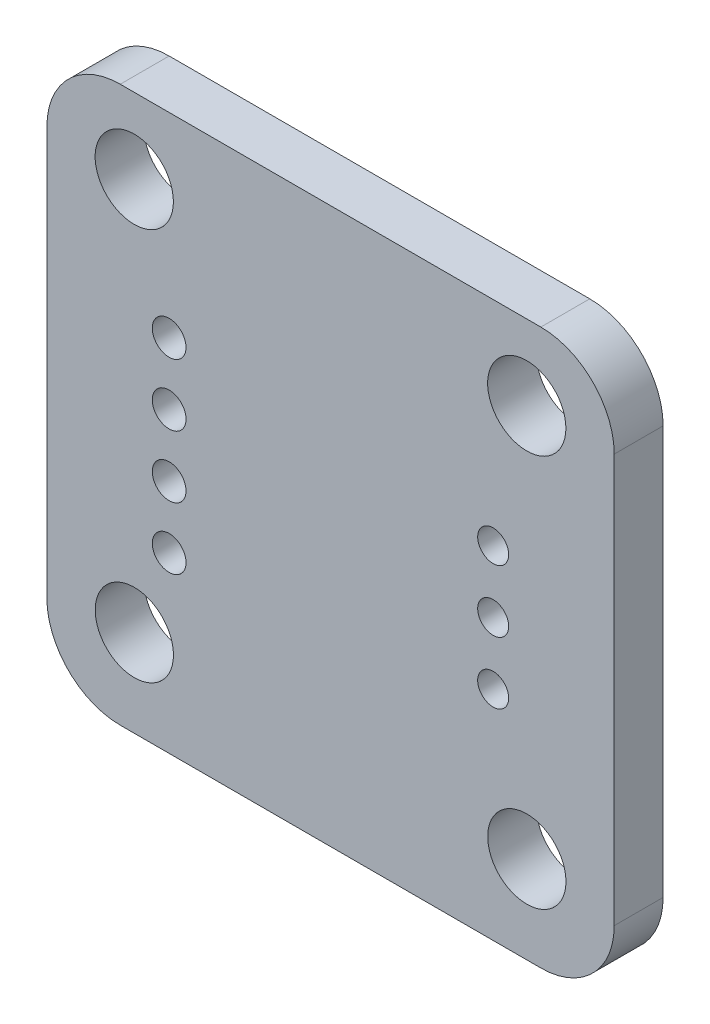
ISO-10303-21;
HEADER;
FILE_DESCRIPTION(('STEP AP214'),'2;1');
FILE_NAME('part.step','',(''),(''),'','','');
FILE_SCHEMA(('AUTOMOTIVE_DESIGN { 1 0 10303 214 1 1 1 1 }'));
ENDSEC;
DATA;
#1=APPLICATION_CONTEXT('core data for automotive mechanical design processes');
#2=APPLICATION_PROTOCOL_DEFINITION('international standard','automotive_design',2000,#1);
#3=PRODUCT_CONTEXT('',#1,'mechanical');
#4=PRODUCT('Part','Part','',(#3));
#5=PRODUCT_RELATED_PRODUCT_CATEGORY('part','',(#4));
#6=PRODUCT_DEFINITION_FORMATION('','',#4);
#7=PRODUCT_DEFINITION_CONTEXT('part definition',#1,'design');
#8=PRODUCT_DEFINITION('design','',#6,#7);
#9=PRODUCT_DEFINITION_SHAPE('','',#8);
#10=(LENGTH_UNIT() NAMED_UNIT(*) SI_UNIT(.MILLI.,.METRE.));
#11=(NAMED_UNIT(*) PLANE_ANGLE_UNIT() SI_UNIT($,.RADIAN.));
#12=(NAMED_UNIT(*) SI_UNIT($,.STERADIAN.) SOLID_ANGLE_UNIT());
#13=UNCERTAINTY_MEASURE_WITH_UNIT(LENGTH_MEASURE(1.E-05),#10,'distance_accuracy_value','');
#14=(GEOMETRIC_REPRESENTATION_CONTEXT(3) GLOBAL_UNCERTAINTY_ASSIGNED_CONTEXT((#13)) GLOBAL_UNIT_ASSIGNED_CONTEXT((#10,
#11,#12)) REPRESENTATION_CONTEXT('',''));
#15=CARTESIAN_POINT('',(0.,0.,0.));
#16=DIRECTION('',(0.,0.,1.));
#17=DIRECTION('',(1.,0.,0.));
#18=AXIS2_PLACEMENT_3D('',#15,#16,#17);
#19=CARTESIAN_POINT('',(0.,0.,2.));
#20=DIRECTION('',(0.,0.,1.));
#21=DIRECTION('',(1.,0.,0.));
#22=AXIS2_PLACEMENT_3D('',#19,#20,#21);
#23=PLANE('',#22);
#24=CARTESIAN_POINT('',(6.64706805457635,-0.157067135375505,2.));
#25=DIRECTION('',(0.,0.,1.));
#26=DIRECTION('',(1.,0.,0.));
#27=AXIS2_PLACEMENT_3D('',#24,#25,#26);
#28=CIRCLE('',#27,0.633596252878906);
#29=CARTESIAN_POINT('',(7.28066430745526,-0.157067135375505,2.));
#30=VERTEX_POINT('',#29);
#31=EDGE_CURVE('E226',#30,#30,#28,.T.);
#32=ORIENTED_EDGE('',*,*,#31,.F.);
#33=EDGE_LOOP('',(#32));
#34=FACE_BOUND('',#33,.T.);
#35=CARTESIAN_POINT('',(6.64706805457635,2.3829328646245,2.));
#36=DIRECTION('',(0.,0.,1.));
#37=DIRECTION('',(1.,0.,0.));
#38=AXIS2_PLACEMENT_3D('',#35,#36,#37);
#39=CIRCLE('',#38,0.633596252878906);
#40=CARTESIAN_POINT('',(7.28066430745526,2.3829328646245,2.));
#41=VERTEX_POINT('',#40);
#42=EDGE_CURVE('E220',#41,#41,#39,.T.);
#43=ORIENTED_EDGE('',*,*,#42,.F.);
#44=EDGE_LOOP('',(#43));
#45=FACE_BOUND('',#44,.T.);
#46=CARTESIAN_POINT('',(-6.60293194542365,-4.49706713537551,2.));
#47=DIRECTION('',(0.,0.,1.));
#48=DIRECTION('',(1.,0.,0.));
#49=AXIS2_PLACEMENT_3D('',#46,#47,#48);
#50=CIRCLE('',#49,0.690319611344519);
#51=CARTESIAN_POINT('',(-5.91261233407913,-4.49706713537551,2.));
#52=VERTEX_POINT('',#51);
#53=EDGE_CURVE('E214',#52,#52,#50,.T.);
#54=ORIENTED_EDGE('',*,*,#53,.F.);
#55=EDGE_LOOP('',(#54));
#56=FACE_BOUND('',#55,.T.);
#57=CARTESIAN_POINT('',(-6.60293194542365,-1.95706713537551,2.));
#58=DIRECTION('',(0.,0.,1.));
#59=DIRECTION('',(1.,0.,0.));
#60=AXIS2_PLACEMENT_3D('',#57,#58,#59);
#61=CIRCLE('',#60,0.690319611344519);
#62=CARTESIAN_POINT('',(-5.91261233407913,-1.95706713537551,2.));
#63=VERTEX_POINT('',#62);
#64=EDGE_CURVE('E207',#63,#63,#61,.T.);
#65=ORIENTED_EDGE('',*,*,#64,.F.);
#66=EDGE_LOOP('',(#65));
#67=FACE_BOUND('',#66,.T.);
#68=CARTESIAN_POINT('',(-6.60293194542365,0.582932864624494,2.));
#69=DIRECTION('',(0.,0.,1.));
#70=DIRECTION('',(1.,0.,0.));
#71=AXIS2_PLACEMENT_3D('',#68,#69,#70);
#72=CIRCLE('',#71,0.690319611344519);
#73=CARTESIAN_POINT('',(-5.91261233407913,0.582932864624494,2.));
#74=VERTEX_POINT('',#73);
#75=EDGE_CURVE('E237',#74,#74,#72,.T.);
#76=ORIENTED_EDGE('',*,*,#75,.F.);
#77=EDGE_LOOP('',(#76));
#78=FACE_BOUND('',#77,.T.);
#79=CARTESIAN_POINT('',(-6.60293194542365,3.12293286462449,2.));
#80=DIRECTION('',(0.,0.,1.));
#81=DIRECTION('',(1.,0.,0.));
#82=AXIS2_PLACEMENT_3D('',#79,#80,#81);
#83=CIRCLE('',#82,0.690319611344519);
#84=CARTESIAN_POINT('',(-5.91261233407913,3.12293286462449,2.));
#85=VERTEX_POINT('',#84);
#86=EDGE_CURVE('E231',#85,#85,#83,.T.);
#87=ORIENTED_EDGE('',*,*,#86,.F.);
#88=EDGE_LOOP('',(#87));
#89=FACE_BOUND('',#88,.T.);
#90=CARTESIAN_POINT('',(6.64706805457635,-2.6970671353755,2.));
#91=DIRECTION('',(0.,0.,1.));
#92=DIRECTION('',(1.,0.,0.));
#93=AXIS2_PLACEMENT_3D('',#90,#91,#92);
#94=CIRCLE('',#93,0.633596252878906);
#95=CARTESIAN_POINT('',(7.28066430745526,-2.6970671353755,2.));
#96=VERTEX_POINT('',#95);
#97=EDGE_CURVE('E201',#96,#96,#94,.T.);
#98=ORIENTED_EDGE('',*,*,#97,.F.);
#99=EDGE_LOOP('',(#98));
#100=FACE_BOUND('',#99,.T.);
#101=CARTESIAN_POINT('',(8.02395036749889,-8.02421567539647,2.));
#102=DIRECTION('',(0.,0.,1.));
#103=DIRECTION('',(1.,0.,0.));
#104=AXIS2_PLACEMENT_3D('',#101,#102,#103);
#105=CIRCLE('',#104,1.6);
#106=CARTESIAN_POINT('',(9.62395036749889,-8.02421567539647,2.));
#107=VERTEX_POINT('',#106);
#108=EDGE_CURVE('E186',#107,#107,#105,.T.);
#109=ORIENTED_EDGE('',*,*,#108,.F.);
#110=EDGE_LOOP('',(#109));
#111=FACE_BOUND('',#110,.T.);
#112=CARTESIAN_POINT('',(-8.02981425834602,8.02421383699495,2.));
#113=DIRECTION('',(0.,0.,1.));
#114=DIRECTION('',(1.,0.,0.));
#115=AXIS2_PLACEMENT_3D('',#112,#113,#114);
#116=CIRCLE('',#115,1.6);
#117=CARTESIAN_POINT('',(-6.42981425834602,8.02421383699495,2.));
#118=VERTEX_POINT('',#117);
#119=EDGE_CURVE('E127',#118,#118,#116,.T.);
#120=ORIENTED_EDGE('',*,*,#119,.F.);
#121=EDGE_LOOP('',(#120));
#122=FACE_BOUND('',#121,.T.);
#123=DIRECTION('',(1.,0.,0.));
#124=VECTOR('',#123,1.);
#125=CARTESIAN_POINT('',(-11.6029319454236,-11.5970671353755,2.));
#126=LINE('',#125,#124);
#127=CARTESIAN_POINT('',(-8.60293194542365,-11.5970671353755,2.));
#128=VERTEX_POINT('',#127);
#129=CARTESIAN_POINT('',(8.59706805457635,-11.5970671353755,2.));
#130=VERTEX_POINT('',#129);
#131=EDGE_CURVE('E136',#128,#130,#126,.T.);
#132=ORIENTED_EDGE('',*,*,#131,.T.);
#133=CARTESIAN_POINT('',(8.59706805457635,-8.59706713537551,2.));
#134=DIRECTION('',(0.,0.,1.));
#135=DIRECTION('',(1.,0.,0.));
#136=AXIS2_PLACEMENT_3D('',#133,#134,#135);
#137=CIRCLE('',#136,3.);
#138=CARTESIAN_POINT('',(11.5970680545764,-8.59706713537551,2.));
#139=VERTEX_POINT('',#138);
#140=EDGE_CURVE('E155',#130,#139,#137,.T.);
#141=ORIENTED_EDGE('',*,*,#140,.T.);
#142=DIRECTION('',(0.,1.,0.));
#143=VECTOR('',#142,1.);
#144=CARTESIAN_POINT('',(11.5970680545764,11.1029328646245,2.));
#145=LINE('',#144,#143);
#146=CARTESIAN_POINT('',(11.5970680545764,8.10293286462449,2.));
#147=VERTEX_POINT('',#146);
#148=EDGE_CURVE('E119',#139,#147,#145,.T.);
#149=ORIENTED_EDGE('',*,*,#148,.T.);
#150=CARTESIAN_POINT('',(8.59706805457635,8.10293286462449,2.));
#151=DIRECTION('',(0.,0.,1.));
#152=DIRECTION('',(1.,0.,0.));
#153=AXIS2_PLACEMENT_3D('',#150,#151,#152);
#154=CIRCLE('',#153,3.);
#155=CARTESIAN_POINT('',(8.59706805457635,11.1029328646245,2.));
#156=VERTEX_POINT('',#155);
#157=EDGE_CURVE('E150',#147,#156,#154,.T.);
#158=ORIENTED_EDGE('',*,*,#157,.T.);
#159=DIRECTION('',(-1.,0.,0.));
#160=VECTOR('',#159,1.);
#161=CARTESIAN_POINT('',(-11.6029319454236,11.1029328646245,2.));
#162=LINE('',#161,#160);
#163=CARTESIAN_POINT('',(-8.60293194542365,11.1029328646245,2.));
#164=VERTEX_POINT('',#163);
#165=EDGE_CURVE('E166',#156,#164,#162,.T.);
#166=ORIENTED_EDGE('',*,*,#165,.T.);
#167=CARTESIAN_POINT('',(-8.60293194542365,8.10293286462449,2.));
#168=DIRECTION('',(0.,0.,1.));
#169=DIRECTION('',(1.,0.,0.));
#170=AXIS2_PLACEMENT_3D('',#167,#168,#169);
#171=CIRCLE('',#170,3.);
#172=CARTESIAN_POINT('',(-11.6029319454236,8.10293286462449,2.));
#173=VERTEX_POINT('',#172);
#174=EDGE_CURVE('E55',#164,#173,#171,.T.);
#175=ORIENTED_EDGE('',*,*,#174,.T.);
#176=DIRECTION('',(0.,-1.,0.));
#177=VECTOR('',#176,1.);
#178=CARTESIAN_POINT('',(-11.6029319454236,11.1029328646245,2.));
#179=LINE('',#178,#177);
#180=CARTESIAN_POINT('',(-11.6029319454236,-8.59706713537551,2.));
#181=VERTEX_POINT('',#180);
#182=EDGE_CURVE('E174',#173,#181,#179,.T.);
#183=ORIENTED_EDGE('',*,*,#182,.T.);
#184=CARTESIAN_POINT('',(-8.60293194542365,-8.59706713537551,2.));
#185=DIRECTION('',(0.,0.,1.));
#186=DIRECTION('',(1.,0.,0.));
#187=AXIS2_PLACEMENT_3D('',#184,#185,#186);
#188=CIRCLE('',#187,3.);
#189=EDGE_CURVE('E153',#181,#128,#188,.T.);
#190=ORIENTED_EDGE('',*,*,#189,.T.);
#191=EDGE_LOOP('',(#132,#141,#149,#158,#166,#175,#183,#190));
#192=FACE_BOUND('',#191,.T.);
#193=CARTESIAN_POINT('',(8.02128281077218,8.02688139372171,2.));
#194=DIRECTION('',(0.,0.,1.));
#195=DIRECTION('',(1.,0.,0.));
#196=AXIS2_PLACEMENT_3D('',#193,#194,#195);
#197=CIRCLE('',#196,1.6);
#198=CARTESIAN_POINT('',(9.62128281077218,8.02688139372171,2.));
#199=VERTEX_POINT('',#198);
#200=EDGE_CURVE('E181',#199,#199,#197,.T.);
#201=ORIENTED_EDGE('',*,*,#200,.F.);
#202=EDGE_LOOP('',(#201));
#203=FACE_BOUND('',#202,.T.);
#204=CARTESIAN_POINT('',(-8.0271467016193,-8.02688323212313,2.));
#205=DIRECTION('',(0.,0.,1.));
#206=DIRECTION('',(1.,0.,0.));
#207=AXIS2_PLACEMENT_3D('',#204,#205,#206);
#208=CIRCLE('',#207,1.6);
#209=CARTESIAN_POINT('',(-6.4271467016193,-8.02688323212313,2.));
#210=VERTEX_POINT('',#209);
#211=EDGE_CURVE('E192',#210,#210,#208,.T.);
#212=ORIENTED_EDGE('',*,*,#211,.F.);
#213=EDGE_LOOP('',(#212));
#214=FACE_BOUND('',#213,.T.);
#215=ADVANCED_FACE('F33',(#34,#45,#56,#67,#78,#89,#100,#111,#122,#192,#203,#214),#23,.T.);
#216=CARTESIAN_POINT('',(0.,0.,0.));
#217=DIRECTION('',(0.,0.,1.));
#218=DIRECTION('',(1.,0.,0.));
#219=AXIS2_PLACEMENT_3D('',#216,#217,#218);
#220=PLANE('',#219);
#221=CARTESIAN_POINT('',(6.64706805457635,-0.157067135375505,0.));
#222=DIRECTION('',(0.,0.,1.));
#223=DIRECTION('',(1.,0.,0.));
#224=AXIS2_PLACEMENT_3D('',#221,#222,#223);
#225=CIRCLE('',#224,0.633596252878906);
#226=CARTESIAN_POINT('',(7.28066430745526,-0.157067135375505,0.));
#227=VERTEX_POINT('',#226);
#228=EDGE_CURVE('E204',#227,#227,#225,.T.);
#229=ORIENTED_EDGE('',*,*,#228,.T.);
#230=EDGE_LOOP('',(#229));
#231=FACE_BOUND('',#230,.T.);
#232=CARTESIAN_POINT('',(6.64706805457635,2.3829328646245,0.));
#233=DIRECTION('',(0.,0.,1.));
#234=DIRECTION('',(1.,0.,0.));
#235=AXIS2_PLACEMENT_3D('',#232,#233,#234);
#236=CIRCLE('',#235,0.633596252878906);
#237=CARTESIAN_POINT('',(7.28066430745526,2.3829328646245,0.));
#238=VERTEX_POINT('',#237);
#239=EDGE_CURVE('E223',#238,#238,#236,.T.);
#240=ORIENTED_EDGE('',*,*,#239,.T.);
#241=EDGE_LOOP('',(#240));
#242=FACE_BOUND('',#241,.T.);
#243=CARTESIAN_POINT('',(-6.60293194542365,-4.49706713537551,0.));
#244=DIRECTION('',(0.,0.,1.));
#245=DIRECTION('',(1.,0.,0.));
#246=AXIS2_PLACEMENT_3D('',#243,#244,#245);
#247=CIRCLE('',#246,0.690319611344519);
#248=CARTESIAN_POINT('',(-5.91261233407913,-4.49706713537551,0.));
#249=VERTEX_POINT('',#248);
#250=EDGE_CURVE('E217',#249,#249,#247,.T.);
#251=ORIENTED_EDGE('',*,*,#250,.T.);
#252=EDGE_LOOP('',(#251));
#253=FACE_BOUND('',#252,.T.);
#254=CARTESIAN_POINT('',(-6.60293194542365,-1.95706713537551,0.));
#255=DIRECTION('',(0.,0.,1.));
#256=DIRECTION('',(1.,0.,0.));
#257=AXIS2_PLACEMENT_3D('',#254,#255,#256);
#258=CIRCLE('',#257,0.690319611344519);
#259=CARTESIAN_POINT('',(-5.91261233407913,-1.95706713537551,0.));
#260=VERTEX_POINT('',#259);
#261=EDGE_CURVE('E210',#260,#260,#258,.T.);
#262=ORIENTED_EDGE('',*,*,#261,.T.);
#263=EDGE_LOOP('',(#262));
#264=FACE_BOUND('',#263,.T.);
#265=CARTESIAN_POINT('',(-6.60293194542365,0.582932864624494,0.));
#266=DIRECTION('',(0.,0.,1.));
#267=DIRECTION('',(1.,0.,0.));
#268=AXIS2_PLACEMENT_3D('',#265,#266,#267);
#269=CIRCLE('',#268,0.690319611344519);
#270=CARTESIAN_POINT('',(-5.91261233407913,0.582932864624494,0.));
#271=VERTEX_POINT('',#270);
#272=EDGE_CURVE('E211',#271,#271,#269,.T.);
#273=ORIENTED_EDGE('',*,*,#272,.T.);
#274=EDGE_LOOP('',(#273));
#275=FACE_BOUND('',#274,.T.);
#276=CARTESIAN_POINT('',(-6.60293194542365,3.12293286462449,0.));
#277=DIRECTION('',(0.,0.,1.));
#278=DIRECTION('',(1.,0.,0.));
#279=AXIS2_PLACEMENT_3D('',#276,#277,#278);
#280=CIRCLE('',#279,0.690319611344519);
#281=CARTESIAN_POINT('',(-5.91261233407913,3.12293286462449,0.));
#282=VERTEX_POINT('',#281);
#283=EDGE_CURVE('E234',#282,#282,#280,.T.);
#284=ORIENTED_EDGE('',*,*,#283,.T.);
#285=EDGE_LOOP('',(#284));
#286=FACE_BOUND('',#285,.T.);
#287=CARTESIAN_POINT('',(6.64706805457635,-2.6970671353755,0.));
#288=DIRECTION('',(0.,0.,1.));
#289=DIRECTION('',(1.,0.,0.));
#290=AXIS2_PLACEMENT_3D('',#287,#288,#289);
#291=CIRCLE('',#290,0.633596252878906);
#292=CARTESIAN_POINT('',(7.28066430745526,-2.6970671353755,0.));
#293=VERTEX_POINT('',#292);
#294=EDGE_CURVE('E198',#293,#293,#291,.T.);
#295=ORIENTED_EDGE('',*,*,#294,.T.);
#296=EDGE_LOOP('',(#295));
#297=FACE_BOUND('',#296,.T.);
#298=DIRECTION('',(0.,1.,0.));
#299=VECTOR('',#298,1.);
#300=CARTESIAN_POINT('',(11.5970680545764,11.1029328646245,0.));
#301=LINE('',#300,#299);
#302=CARTESIAN_POINT('',(11.5970680545764,-8.59706713537551,0.));
#303=VERTEX_POINT('',#302);
#304=CARTESIAN_POINT('',(11.5970680545764,8.10293286462449,0.));
#305=VERTEX_POINT('',#304);
#306=EDGE_CURVE('E116',#303,#305,#301,.T.);
#307=ORIENTED_EDGE('',*,*,#306,.F.);
#308=CARTESIAN_POINT('',(8.59706805457635,-8.59706713537551,0.));
#309=DIRECTION('',(0.,0.,1.));
#310=DIRECTION('',(1.,0.,0.));
#311=AXIS2_PLACEMENT_3D('',#308,#309,#310);
#312=CIRCLE('',#311,3.);
#313=CARTESIAN_POINT('',(8.59706805457635,-11.5970671353755,0.));
#314=VERTEX_POINT('',#313);
#315=EDGE_CURVE('E99',#303,#314,#312,.F.);
#316=ORIENTED_EDGE('',*,*,#315,.T.);
#317=DIRECTION('',(1.,0.,0.));
#318=VECTOR('',#317,1.);
#319=CARTESIAN_POINT('',(-11.6029319454236,-11.5970671353755,0.));
#320=LINE('',#319,#318);
#321=CARTESIAN_POINT('',(-8.60293194542365,-11.5970671353755,0.));
#322=VERTEX_POINT('',#321);
#323=EDGE_CURVE('E140',#322,#314,#320,.T.);
#324=ORIENTED_EDGE('',*,*,#323,.F.);
#325=CARTESIAN_POINT('',(-8.60293194542365,-8.59706713537551,0.));
#326=DIRECTION('',(0.,0.,1.));
#327=DIRECTION('',(1.,0.,0.));
#328=AXIS2_PLACEMENT_3D('',#325,#326,#327);
#329=CIRCLE('',#328,3.);
#330=CARTESIAN_POINT('',(-11.6029319454236,-8.59706713537551,0.));
#331=VERTEX_POINT('',#330);
#332=EDGE_CURVE('E110',#322,#331,#329,.F.);
#333=ORIENTED_EDGE('',*,*,#332,.T.);
#334=DIRECTION('',(0.,-1.,0.));
#335=VECTOR('',#334,1.);
#336=CARTESIAN_POINT('',(-11.6029319454236,11.1029328646245,0.));
#337=LINE('',#336,#335);
#338=CARTESIAN_POINT('',(-11.6029319454236,8.10293286462449,0.));
#339=VERTEX_POINT('',#338);
#340=EDGE_CURVE('E130',#339,#331,#337,.T.);
#341=ORIENTED_EDGE('',*,*,#340,.F.);
#342=CARTESIAN_POINT('',(-8.60293194542365,8.10293286462449,0.));
#343=DIRECTION('',(0.,0.,1.));
#344=DIRECTION('',(1.,0.,0.));
#345=AXIS2_PLACEMENT_3D('',#342,#343,#344);
#346=CIRCLE('',#345,3.);
#347=CARTESIAN_POINT('',(-8.60293194542365,11.1029328646245,0.));
#348=VERTEX_POINT('',#347);
#349=EDGE_CURVE('E144',#339,#348,#346,.F.);
#350=ORIENTED_EDGE('',*,*,#349,.T.);
#351=DIRECTION('',(-1.,0.,0.));
#352=VECTOR('',#351,1.);
#353=CARTESIAN_POINT('',(-11.6029319454236,11.1029328646245,0.));
#354=LINE('',#353,#352);
#355=CARTESIAN_POINT('',(8.59706805457635,11.1029328646245,0.));
#356=VERTEX_POINT('',#355);
#357=EDGE_CURVE('E126',#356,#348,#354,.T.);
#358=ORIENTED_EDGE('',*,*,#357,.F.);
#359=CARTESIAN_POINT('',(8.59706805457635,8.10293286462449,0.));
#360=DIRECTION('',(0.,0.,1.));
#361=DIRECTION('',(1.,0.,0.));
#362=AXIS2_PLACEMENT_3D('',#359,#360,#361);
#363=CIRCLE('',#362,3.);
#364=EDGE_CURVE('E120',#356,#305,#363,.F.);
#365=ORIENTED_EDGE('',*,*,#364,.T.);
#366=EDGE_LOOP('',(#307,#316,#324,#333,#341,#350,#358,#365));
#367=FACE_BOUND('',#366,.T.);
#368=CARTESIAN_POINT('',(-8.02981425834602,8.02421383699495,0.));
#369=DIRECTION('',(0.,0.,1.));
#370=DIRECTION('',(1.,0.,0.));
#371=AXIS2_PLACEMENT_3D('',#368,#369,#370);
#372=CIRCLE('',#371,1.6);
#373=CARTESIAN_POINT('',(-6.42981425834602,8.02421383699495,0.));
#374=VERTEX_POINT('',#373);
#375=EDGE_CURVE('E133',#374,#374,#372,.T.);
#376=ORIENTED_EDGE('',*,*,#375,.T.);
#377=EDGE_LOOP('',(#376));
#378=FACE_BOUND('',#377,.T.);
#379=CARTESIAN_POINT('',(8.02128281077218,8.02688139372171,0.));
#380=DIRECTION('',(0.,0.,1.));
#381=DIRECTION('',(1.,0.,0.));
#382=AXIS2_PLACEMENT_3D('',#379,#380,#381);
#383=CIRCLE('',#382,1.6);
#384=CARTESIAN_POINT('',(9.62128281077218,8.02688139372171,0.));
#385=VERTEX_POINT('',#384);
#386=EDGE_CURVE('E183',#385,#385,#383,.T.);
#387=ORIENTED_EDGE('',*,*,#386,.T.);
#388=EDGE_LOOP('',(#387));
#389=FACE_BOUND('',#388,.T.);
#390=CARTESIAN_POINT('',(8.02395036749889,-8.02421567539647,0.));
#391=DIRECTION('',(0.,0.,1.));
#392=DIRECTION('',(1.,0.,0.));
#393=AXIS2_PLACEMENT_3D('',#390,#391,#392);
#394=CIRCLE('',#393,1.6);
#395=CARTESIAN_POINT('',(9.62395036749889,-8.02421567539647,0.));
#396=VERTEX_POINT('',#395);
#397=EDGE_CURVE('E189',#396,#396,#394,.T.);
#398=ORIENTED_EDGE('',*,*,#397,.T.);
#399=EDGE_LOOP('',(#398));
#400=FACE_BOUND('',#399,.T.);
#401=CARTESIAN_POINT('',(-8.0271467016193,-8.02688323212313,0.));
#402=DIRECTION('',(0.,0.,1.));
#403=DIRECTION('',(1.,0.,0.));
#404=AXIS2_PLACEMENT_3D('',#401,#402,#403);
#405=CIRCLE('',#404,1.6);
#406=CARTESIAN_POINT('',(-6.4271467016193,-8.02688323212313,0.));
#407=VERTEX_POINT('',#406);
#408=EDGE_CURVE('E195',#407,#407,#405,.T.);
#409=ORIENTED_EDGE('',*,*,#408,.T.);
#410=EDGE_LOOP('',(#409));
#411=FACE_BOUND('',#410,.T.);
#412=ADVANCED_FACE('F123',(#231,#242,#253,#264,#275,#286,#297,#367,#378,#389,#400,#411),#220,.F.);
#413=CARTESIAN_POINT('',(11.5970680545764,11.1029328646245,2.));
#414=DIRECTION('',(-1.,0.,0.));
#415=DIRECTION('',(0.,0.,1.));
#416=AXIS2_PLACEMENT_3D('',#413,#414,#415);
#417=PLANE('',#416);
#418=ORIENTED_EDGE('',*,*,#148,.F.);
#419=DIRECTION('',(0.,0.,-1.));
#420=VECTOR('',#419,1.);
#421=CARTESIAN_POINT('',(11.5970680545764,-8.59706713537551,2.));
#422=LINE('',#421,#420);
#423=EDGE_CURVE('E103',#139,#303,#422,.T.);
#424=ORIENTED_EDGE('',*,*,#423,.T.);
#425=ORIENTED_EDGE('',*,*,#306,.T.);
#426=DIRECTION('',(0.,0.,-1.));
#427=VECTOR('',#426,1.);
#428=CARTESIAN_POINT('',(11.5970680545764,8.10293286462449,2.));
#429=LINE('',#428,#427);
#430=EDGE_CURVE('E121',#305,#147,#429,.F.);
#431=ORIENTED_EDGE('',*,*,#430,.T.);
#432=EDGE_LOOP('',(#418,#424,#425,#431));
#433=FACE_BOUND('',#432,.T.);
#434=ADVANCED_FACE('F115',(#433),#417,.F.);
#435=CARTESIAN_POINT('',(-11.6029319454236,11.1029328646245,2.));
#436=DIRECTION('',(0.,-1.,0.));
#437=DIRECTION('',(0.,0.,-1.));
#438=AXIS2_PLACEMENT_3D('',#435,#436,#437);
#439=PLANE('',#438);
#440=ORIENTED_EDGE('',*,*,#357,.T.);
#441=DIRECTION('',(0.,0.,-1.));
#442=VECTOR('',#441,1.);
#443=CARTESIAN_POINT('',(-8.60293194542365,11.1029328646245,2.));
#444=LINE('',#443,#442);
#445=EDGE_CURVE('E11',#348,#164,#444,.F.);
#446=ORIENTED_EDGE('',*,*,#445,.T.);
#447=ORIENTED_EDGE('',*,*,#165,.F.);
#448=DIRECTION('',(0.,0.,-1.));
#449=VECTOR('',#448,1.);
#450=CARTESIAN_POINT('',(8.59706805457635,11.1029328646245,2.));
#451=LINE('',#450,#449);
#452=EDGE_CURVE('E41',#156,#356,#451,.T.);
#453=ORIENTED_EDGE('',*,*,#452,.T.);
#454=EDGE_LOOP('',(#440,#446,#447,#453));
#455=FACE_BOUND('',#454,.T.);
#456=ADVANCED_FACE('F164',(#455),#439,.F.);
#457=CARTESIAN_POINT('',(-11.6029319454236,11.1029328646245,2.));
#458=DIRECTION('',(1.,0.,0.));
#459=DIRECTION('',(0.,0.,-1.));
#460=AXIS2_PLACEMENT_3D('',#457,#458,#459);
#461=PLANE('',#460);
#462=ORIENTED_EDGE('',*,*,#340,.T.);
#463=DIRECTION('',(0.,0.,-1.));
#464=VECTOR('',#463,1.);
#465=CARTESIAN_POINT('',(-11.6029319454236,-8.59706713537551,2.));
#466=LINE('',#465,#464);
#467=EDGE_CURVE('E48',#331,#181,#466,.F.);
#468=ORIENTED_EDGE('',*,*,#467,.T.);
#469=ORIENTED_EDGE('',*,*,#182,.F.);
#470=DIRECTION('',(0.,0.,-1.));
#471=VECTOR('',#470,1.);
#472=CARTESIAN_POINT('',(-11.6029319454236,8.10293286462449,2.));
#473=LINE('',#472,#471);
#474=EDGE_CURVE('E157',#173,#339,#473,.T.);
#475=ORIENTED_EDGE('',*,*,#474,.T.);
#476=EDGE_LOOP('',(#462,#468,#469,#475));
#477=FACE_BOUND('',#476,.T.);
#478=ADVANCED_FACE('F173',(#477),#461,.F.);
#479=CARTESIAN_POINT('',(-11.6029319454236,-11.5970671353755,2.));
#480=DIRECTION('',(0.,1.,0.));
#481=DIRECTION('',(0.,0.,1.));
#482=AXIS2_PLACEMENT_3D('',#479,#480,#481);
#483=PLANE('',#482);
#484=ORIENTED_EDGE('',*,*,#323,.T.);
#485=DIRECTION('',(0.,0.,-1.));
#486=VECTOR('',#485,1.);
#487=CARTESIAN_POINT('',(8.59706805457635,-11.5970671353755,2.));
#488=LINE('',#487,#486);
#489=EDGE_CURVE('E104',#314,#130,#488,.F.);
#490=ORIENTED_EDGE('',*,*,#489,.T.);
#491=ORIENTED_EDGE('',*,*,#131,.F.);
#492=DIRECTION('',(0.,0.,-1.));
#493=VECTOR('',#492,1.);
#494=CARTESIAN_POINT('',(-8.60293194542365,-11.5970671353755,2.));
#495=LINE('',#494,#493);
#496=EDGE_CURVE('E109',#128,#322,#495,.T.);
#497=ORIENTED_EDGE('',*,*,#496,.T.);
#498=EDGE_LOOP('',(#484,#490,#491,#497));
#499=FACE_BOUND('',#498,.T.);
#500=ADVANCED_FACE('F287',(#499),#483,.F.);
#501=CARTESIAN_POINT('',(-8.02981425834602,8.02421383699495,2.));
#502=DIRECTION('',(0.,0.,-1.));
#503=DIRECTION('',(-1.,0.,0.));
#504=AXIS2_PLACEMENT_3D('',#501,#502,#503);
#505=CYLINDRICAL_SURFACE('',#504,1.6);
#506=ORIENTED_EDGE('',*,*,#119,.T.);
#507=EDGE_LOOP('',(#506));
#508=FACE_BOUND('',#507,.T.);
#509=ORIENTED_EDGE('',*,*,#375,.F.);
#510=EDGE_LOOP('',(#509));
#511=FACE_BOUND('',#510,.T.);
#512=ADVANCED_FACE('F290',(#508,#511),#505,.F.);
#513=CARTESIAN_POINT('',(8.02128281077218,8.02688139372171,2.));
#514=DIRECTION('',(0.,0.,-1.));
#515=DIRECTION('',(-1.,0.,0.));
#516=AXIS2_PLACEMENT_3D('',#513,#514,#515);
#517=CYLINDRICAL_SURFACE('',#516,1.6);
#518=ORIENTED_EDGE('',*,*,#200,.T.);
#519=EDGE_LOOP('',(#518));
#520=FACE_BOUND('',#519,.T.);
#521=ORIENTED_EDGE('',*,*,#386,.F.);
#522=EDGE_LOOP('',(#521));
#523=FACE_BOUND('',#522,.T.);
#524=ADVANCED_FACE('F323',(#520,#523),#517,.F.);
#525=CARTESIAN_POINT('',(8.02395036749889,-8.02421567539647,2.));
#526=DIRECTION('',(0.,0.,-1.));
#527=DIRECTION('',(-1.,0.,0.));
#528=AXIS2_PLACEMENT_3D('',#525,#526,#527);
#529=CYLINDRICAL_SURFACE('',#528,1.6);
#530=ORIENTED_EDGE('',*,*,#108,.T.);
#531=EDGE_LOOP('',(#530));
#532=FACE_BOUND('',#531,.T.);
#533=ORIENTED_EDGE('',*,*,#397,.F.);
#534=EDGE_LOOP('',(#533));
#535=FACE_BOUND('',#534,.T.);
#536=ADVANCED_FACE('F273',(#532,#535),#529,.F.);
#537=CARTESIAN_POINT('',(-8.0271467016193,-8.02688323212313,2.));
#538=DIRECTION('',(0.,0.,-1.));
#539=DIRECTION('',(-1.,0.,0.));
#540=AXIS2_PLACEMENT_3D('',#537,#538,#539);
#541=CYLINDRICAL_SURFACE('',#540,1.6);
#542=ORIENTED_EDGE('',*,*,#211,.T.);
#543=EDGE_LOOP('',(#542));
#544=FACE_BOUND('',#543,.T.);
#545=ORIENTED_EDGE('',*,*,#408,.F.);
#546=EDGE_LOOP('',(#545));
#547=FACE_BOUND('',#546,.T.);
#548=ADVANCED_FACE('F270',(#544,#547),#541,.F.);
#549=CARTESIAN_POINT('',(8.59706805457635,-8.59706713537551,2.));
#550=DIRECTION('',(0.,0.,-1.));
#551=DIRECTION('',(-1.,0.,0.));
#552=AXIS2_PLACEMENT_3D('',#549,#550,#551);
#553=CYLINDRICAL_SURFACE('',#552,3.);
#554=ORIENTED_EDGE('',*,*,#140,.F.);
#555=ORIENTED_EDGE('',*,*,#489,.F.);
#556=ORIENTED_EDGE('',*,*,#315,.F.);
#557=ORIENTED_EDGE('',*,*,#423,.F.);
#558=EDGE_LOOP('',(#554,#555,#556,#557));
#559=FACE_BOUND('',#558,.T.);
#560=ADVANCED_FACE('F102',(#559),#553,.T.);
#561=CARTESIAN_POINT('',(-8.60293194542365,-8.59706713537551,2.));
#562=DIRECTION('',(0.,0.,-1.));
#563=DIRECTION('',(-1.,0.,0.));
#564=AXIS2_PLACEMENT_3D('',#561,#562,#563);
#565=CYLINDRICAL_SURFACE('',#564,3.);
#566=ORIENTED_EDGE('',*,*,#189,.F.);
#567=ORIENTED_EDGE('',*,*,#467,.F.);
#568=ORIENTED_EDGE('',*,*,#332,.F.);
#569=ORIENTED_EDGE('',*,*,#496,.F.);
#570=EDGE_LOOP('',(#566,#567,#568,#569));
#571=FACE_BOUND('',#570,.T.);
#572=ADVANCED_FACE('F298',(#571),#565,.T.);
#573=CARTESIAN_POINT('',(-8.60293194542365,8.10293286462449,2.));
#574=DIRECTION('',(0.,0.,-1.));
#575=DIRECTION('',(-1.,0.,0.));
#576=AXIS2_PLACEMENT_3D('',#573,#574,#575);
#577=CYLINDRICAL_SURFACE('',#576,3.);
#578=ORIENTED_EDGE('',*,*,#174,.F.);
#579=ORIENTED_EDGE('',*,*,#445,.F.);
#580=ORIENTED_EDGE('',*,*,#349,.F.);
#581=ORIENTED_EDGE('',*,*,#474,.F.);
#582=EDGE_LOOP('',(#578,#579,#580,#581));
#583=FACE_BOUND('',#582,.T.);
#584=ADVANCED_FACE('F172',(#583),#577,.T.);
#585=CARTESIAN_POINT('',(8.59706805457635,8.10293286462449,2.));
#586=DIRECTION('',(0.,0.,-1.));
#587=DIRECTION('',(-1.,0.,0.));
#588=AXIS2_PLACEMENT_3D('',#585,#586,#587);
#589=CYLINDRICAL_SURFACE('',#588,3.);
#590=ORIENTED_EDGE('',*,*,#157,.F.);
#591=ORIENTED_EDGE('',*,*,#430,.F.);
#592=ORIENTED_EDGE('',*,*,#364,.F.);
#593=ORIENTED_EDGE('',*,*,#452,.F.);
#594=EDGE_LOOP('',(#590,#591,#592,#593));
#595=FACE_BOUND('',#594,.T.);
#596=ADVANCED_FACE('F35',(#595),#589,.T.);
#597=CARTESIAN_POINT('',(6.64706805457635,-2.6970671353755,0.));
#598=DIRECTION('',(0.,0.,1.));
#599=DIRECTION('',(1.,0.,0.));
#600=AXIS2_PLACEMENT_3D('',#597,#598,#599);
#601=CYLINDRICAL_SURFACE('',#600,0.633596252878906);
#602=ORIENTED_EDGE('',*,*,#294,.F.);
#603=EDGE_LOOP('',(#602));
#604=FACE_BOUND('',#603,.T.);
#605=ORIENTED_EDGE('',*,*,#97,.T.);
#606=EDGE_LOOP('',(#605));
#607=FACE_BOUND('',#606,.T.);
#608=ADVANCED_FACE('F305',(#604,#607),#601,.F.);
#609=CARTESIAN_POINT('',(-6.60293194542365,3.12293286462449,0.));
#610=DIRECTION('',(0.,0.,1.));
#611=DIRECTION('',(1.,0.,0.));
#612=AXIS2_PLACEMENT_3D('',#609,#610,#611);
#613=CYLINDRICAL_SURFACE('',#612,0.690319611344519);
#614=ORIENTED_EDGE('',*,*,#283,.F.);
#615=EDGE_LOOP('',(#614));
#616=FACE_BOUND('',#615,.T.);
#617=ORIENTED_EDGE('',*,*,#86,.T.);
#618=EDGE_LOOP('',(#617));
#619=FACE_BOUND('',#618,.T.);
#620=ADVANCED_FACE('F249',(#616,#619),#613,.F.);
#621=CARTESIAN_POINT('',(-6.60293194542365,0.582932864624494,0.));
#622=DIRECTION('',(0.,0.,1.));
#623=DIRECTION('',(1.,0.,0.));
#624=AXIS2_PLACEMENT_3D('',#621,#622,#623);
#625=CYLINDRICAL_SURFACE('',#624,0.690319611344519);
#626=ORIENTED_EDGE('',*,*,#272,.F.);
#627=EDGE_LOOP('',(#626));
#628=FACE_BOUND('',#627,.T.);
#629=ORIENTED_EDGE('',*,*,#75,.T.);
#630=EDGE_LOOP('',(#629));
#631=FACE_BOUND('',#630,.T.);
#632=ADVANCED_FACE('F245',(#628,#631),#625,.F.);
#633=CARTESIAN_POINT('',(-6.60293194542365,-1.95706713537551,0.));
#634=DIRECTION('',(0.,0.,1.));
#635=DIRECTION('',(1.,0.,0.));
#636=AXIS2_PLACEMENT_3D('',#633,#634,#635);
#637=CYLINDRICAL_SURFACE('',#636,0.690319611344519);
#638=ORIENTED_EDGE('',*,*,#261,.F.);
#639=EDGE_LOOP('',(#638));
#640=FACE_BOUND('',#639,.T.);
#641=ORIENTED_EDGE('',*,*,#64,.T.);
#642=EDGE_LOOP('',(#641));
#643=FACE_BOUND('',#642,.T.);
#644=ADVANCED_FACE('F248',(#640,#643),#637,.F.);
#645=CARTESIAN_POINT('',(-6.60293194542365,-4.49706713537551,0.));
#646=DIRECTION('',(0.,0.,1.));
#647=DIRECTION('',(1.,0.,0.));
#648=AXIS2_PLACEMENT_3D('',#645,#646,#647);
#649=CYLINDRICAL_SURFACE('',#648,0.690319611344519);
#650=ORIENTED_EDGE('',*,*,#250,.F.);
#651=EDGE_LOOP('',(#650));
#652=FACE_BOUND('',#651,.T.);
#653=ORIENTED_EDGE('',*,*,#53,.T.);
#654=EDGE_LOOP('',(#653));
#655=FACE_BOUND('',#654,.T.);
#656=ADVANCED_FACE('F406',(#652,#655),#649,.F.);
#657=CARTESIAN_POINT('',(6.64706805457635,2.3829328646245,0.));
#658=DIRECTION('',(0.,0.,1.));
#659=DIRECTION('',(1.,0.,0.));
#660=AXIS2_PLACEMENT_3D('',#657,#658,#659);
#661=CYLINDRICAL_SURFACE('',#660,0.633596252878906);
#662=ORIENTED_EDGE('',*,*,#239,.F.);
#663=EDGE_LOOP('',(#662));
#664=FACE_BOUND('',#663,.T.);
#665=ORIENTED_EDGE('',*,*,#42,.T.);
#666=EDGE_LOOP('',(#665));
#667=FACE_BOUND('',#666,.T.);
#668=ADVANCED_FACE('F415',(#664,#667),#661,.F.);
#669=CARTESIAN_POINT('',(6.64706805457635,-0.157067135375505,0.));
#670=DIRECTION('',(0.,0.,1.));
#671=DIRECTION('',(1.,0.,0.));
#672=AXIS2_PLACEMENT_3D('',#669,#670,#671);
#673=CYLINDRICAL_SURFACE('',#672,0.633596252878906);
#674=ORIENTED_EDGE('',*,*,#228,.F.);
#675=EDGE_LOOP('',(#674));
#676=FACE_BOUND('',#675,.T.);
#677=ORIENTED_EDGE('',*,*,#31,.T.);
#678=EDGE_LOOP('',(#677));
#679=FACE_BOUND('',#678,.T.);
#680=ADVANCED_FACE('F424',(#676,#679),#673,.F.);
#681=CLOSED_SHELL('',(#215,#412,#434,#456,#478,#500,#512,#524,#536,#548,#560,#572,#584,#596,
#608,#620,#632,#644,#656,#668,#680));
#682=MANIFOLD_SOLID_BREP('B2',#681);
#683=ADVANCED_BREP_SHAPE_REPRESENTATION('',(#18,#682),#14);
#684=SHAPE_DEFINITION_REPRESENTATION(#9,#683);
ENDSEC;
END-ISO-10303-21;
